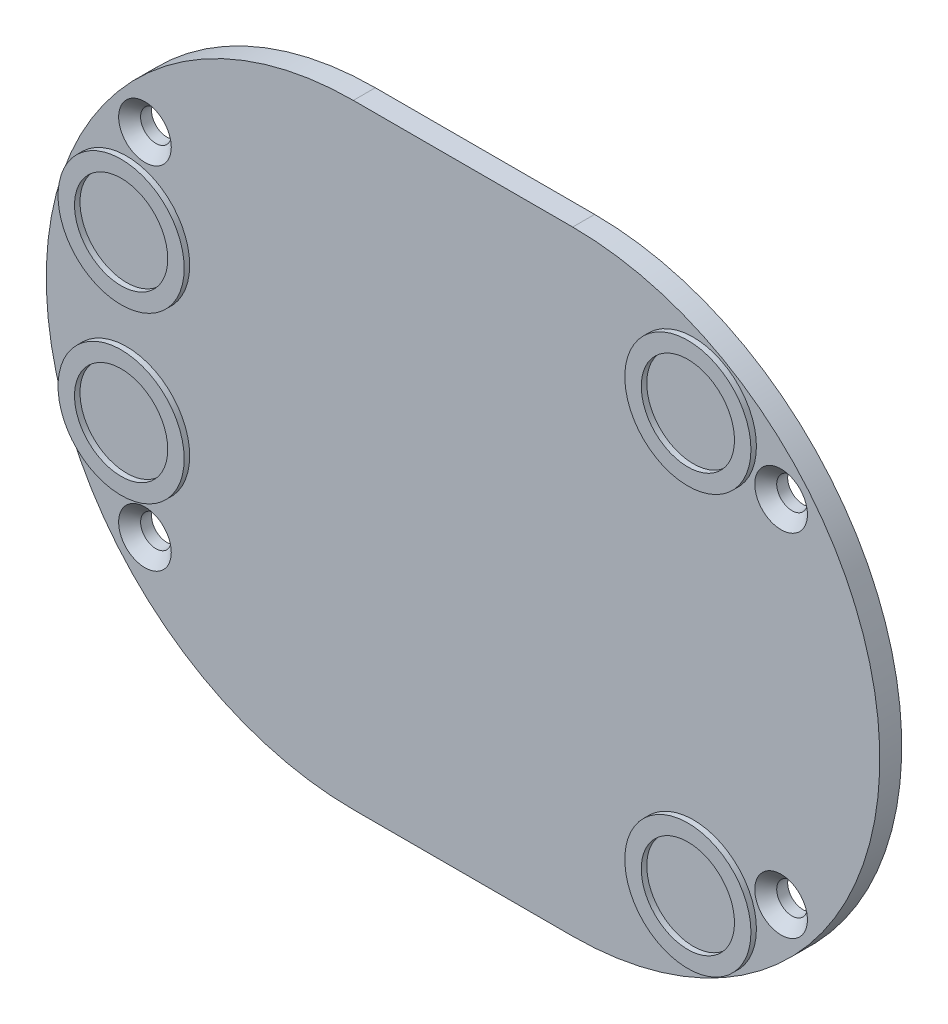
ISO-10303-21;
HEADER;
FILE_DESCRIPTION(('STEP AP214'),'2;1');
FILE_NAME('part.step','',(''),(''),'','','');
FILE_SCHEMA(('AUTOMOTIVE_DESIGN { 1 0 10303 214 1 1 1 1 }'));
ENDSEC;
DATA;
#1=APPLICATION_CONTEXT('core data for automotive mechanical design processes');
#2=APPLICATION_PROTOCOL_DEFINITION('international standard','automotive_design',2000,#1);
#3=PRODUCT_CONTEXT('',#1,'mechanical');
#4=PRODUCT('Part','Part','',(#3));
#5=PRODUCT_RELATED_PRODUCT_CATEGORY('part','',(#4));
#6=PRODUCT_DEFINITION_FORMATION('','',#4);
#7=PRODUCT_DEFINITION_CONTEXT('part definition',#1,'design');
#8=PRODUCT_DEFINITION('design','',#6,#7);
#9=PRODUCT_DEFINITION_SHAPE('','',#8);
#10=(LENGTH_UNIT() NAMED_UNIT(*) SI_UNIT(.MILLI.,.METRE.));
#11=(NAMED_UNIT(*) PLANE_ANGLE_UNIT() SI_UNIT($,.RADIAN.));
#12=(NAMED_UNIT(*) SI_UNIT($,.STERADIAN.) SOLID_ANGLE_UNIT());
#13=UNCERTAINTY_MEASURE_WITH_UNIT(LENGTH_MEASURE(1.E-05),#10,'distance_accuracy_value','');
#14=(GEOMETRIC_REPRESENTATION_CONTEXT(3) GLOBAL_UNCERTAINTY_ASSIGNED_CONTEXT((#13)) GLOBAL_UNIT_ASSIGNED_CONTEXT((#10,
#11,#12)) REPRESENTATION_CONTEXT('',''));
#15=CARTESIAN_POINT('',(0.,0.,0.));
#16=DIRECTION('',(0.,0.,1.));
#17=DIRECTION('',(1.,0.,0.));
#18=AXIS2_PLACEMENT_3D('',#15,#16,#17);
#19=CARTESIAN_POINT('',(-10.,0.,2.));
#20=DIRECTION('',(0.,0.,-1.));
#21=DIRECTION('',(-1.,0.,0.));
#22=AXIS2_PLACEMENT_3D('',#19,#20,#21);
#23=CYLINDRICAL_SURFACE('',#22,28.);
#24=CARTESIAN_POINT('',(-10.,0.,0.));
#25=DIRECTION('',(0.,0.,1.));
#26=DIRECTION('',(1.,0.,0.));
#27=AXIS2_PLACEMENT_3D('',#24,#25,#26);
#28=CIRCLE('',#27,28.);
#29=CARTESIAN_POINT('',(-10.,28.,0.));
#30=VERTEX_POINT('',#29);
#31=CARTESIAN_POINT('',(-10.,-28.,0.));
#32=VERTEX_POINT('',#31);
#33=EDGE_CURVE('E266',#30,#32,#28,.T.);
#34=ORIENTED_EDGE('',*,*,#33,.T.);
#35=DIRECTION('',(0.,0.,-1.));
#36=VECTOR('',#35,1.);
#37=CARTESIAN_POINT('',(-10.,-28.,2.));
#38=LINE('',#37,#36);
#39=CARTESIAN_POINT('',(-10.,-28.,2.));
#40=VERTEX_POINT('',#39);
#41=EDGE_CURVE('E282',#40,#32,#38,.T.);
#42=ORIENTED_EDGE('',*,*,#41,.F.);
#43=CARTESIAN_POINT('',(-10.,0.,2.));
#44=DIRECTION('',(0.,0.,1.));
#45=DIRECTION('',(1.,0.,0.));
#46=AXIS2_PLACEMENT_3D('',#43,#44,#45);
#47=CIRCLE('',#46,28.);
#48=CARTESIAN_POINT('',(-10.,28.,2.));
#49=VERTEX_POINT('',#48);
#50=EDGE_CURVE('E254',#49,#40,#47,.T.);
#51=ORIENTED_EDGE('',*,*,#50,.F.);
#52=DIRECTION('',(0.,0.,-1.));
#53=VECTOR('',#52,1.);
#54=CARTESIAN_POINT('',(-10.,28.,2.));
#55=LINE('',#54,#53);
#56=EDGE_CURVE('E265',#49,#30,#55,.T.);
#57=ORIENTED_EDGE('',*,*,#56,.T.);
#58=EDGE_LOOP('',(#34,#42,#51,#57));
#59=FACE_BOUND('',#58,.T.);
#60=ADVANCED_FACE('F63',(#59),#23,.T.);
#61=CARTESIAN_POINT('',(10.,-28.,2.));
#62=DIRECTION('',(0.,-1.,0.));
#63=DIRECTION('',(1.,0.,0.));
#64=AXIS2_PLACEMENT_3D('',#61,#62,#63);
#65=PLANE('',#64);
#66=DIRECTION('',(-1.,0.,0.));
#67=VECTOR('',#66,1.);
#68=CARTESIAN_POINT('',(10.,-28.,0.));
#69=LINE('',#68,#67);
#70=CARTESIAN_POINT('',(10.,-28.,0.));
#71=VERTEX_POINT('',#70);
#72=EDGE_CURVE('E269',#71,#32,#69,.T.);
#73=ORIENTED_EDGE('',*,*,#72,.F.);
#74=DIRECTION('',(0.,0.,-1.));
#75=VECTOR('',#74,1.);
#76=CARTESIAN_POINT('',(10.,-28.,2.));
#77=LINE('',#76,#75);
#78=CARTESIAN_POINT('',(10.,-28.,2.));
#79=VERTEX_POINT('',#78);
#80=EDGE_CURVE('E280',#79,#71,#77,.T.);
#81=ORIENTED_EDGE('',*,*,#80,.F.);
#82=DIRECTION('',(-1.,0.,0.));
#83=VECTOR('',#82,1.);
#84=CARTESIAN_POINT('',(10.,-28.,2.));
#85=LINE('',#84,#83);
#86=EDGE_CURVE('E256',#79,#40,#85,.T.);
#87=ORIENTED_EDGE('',*,*,#86,.T.);
#88=ORIENTED_EDGE('',*,*,#41,.T.);
#89=EDGE_LOOP('',(#73,#81,#87,#88));
#90=FACE_BOUND('',#89,.T.);
#91=ADVANCED_FACE('F556',(#90),#65,.T.);
#92=CARTESIAN_POINT('',(10.,0.,2.));
#93=DIRECTION('',(0.,0.,-1.));
#94=DIRECTION('',(-1.,0.,0.));
#95=AXIS2_PLACEMENT_3D('',#92,#93,#94);
#96=CYLINDRICAL_SURFACE('',#95,28.);
#97=CARTESIAN_POINT('',(10.,0.,0.));
#98=DIRECTION('',(0.,0.,1.));
#99=DIRECTION('',(1.,0.,0.));
#100=AXIS2_PLACEMENT_3D('',#97,#98,#99);
#101=CIRCLE('',#100,28.);
#102=CARTESIAN_POINT('',(10.,28.,0.));
#103=VERTEX_POINT('',#102);
#104=EDGE_CURVE('E272',#71,#103,#101,.T.);
#105=ORIENTED_EDGE('',*,*,#104,.T.);
#106=DIRECTION('',(0.,0.,-1.));
#107=VECTOR('',#106,1.);
#108=CARTESIAN_POINT('',(10.,28.,2.));
#109=LINE('',#108,#107);
#110=CARTESIAN_POINT('',(10.,28.,2.));
#111=VERTEX_POINT('',#110);
#112=EDGE_CURVE('E278',#111,#103,#109,.T.);
#113=ORIENTED_EDGE('',*,*,#112,.F.);
#114=CARTESIAN_POINT('',(10.,0.,2.));
#115=DIRECTION('',(0.,0.,1.));
#116=DIRECTION('',(1.,0.,0.));
#117=AXIS2_PLACEMENT_3D('',#114,#115,#116);
#118=CIRCLE('',#117,28.);
#119=EDGE_CURVE('E260',#79,#111,#118,.T.);
#120=ORIENTED_EDGE('',*,*,#119,.F.);
#121=ORIENTED_EDGE('',*,*,#80,.T.);
#122=EDGE_LOOP('',(#105,#113,#120,#121));
#123=FACE_BOUND('',#122,.T.);
#124=ADVANCED_FACE('F561',(#123),#96,.T.);
#125=CARTESIAN_POINT('',(-10.,28.,2.));
#126=DIRECTION('',(0.,1.,0.));
#127=DIRECTION('',(-1.,0.,0.));
#128=AXIS2_PLACEMENT_3D('',#125,#126,#127);
#129=PLANE('',#128);
#130=DIRECTION('',(1.,0.,0.));
#131=VECTOR('',#130,1.);
#132=CARTESIAN_POINT('',(-10.,28.,0.));
#133=LINE('',#132,#131);
#134=EDGE_CURVE('E257',#30,#103,#133,.T.);
#135=ORIENTED_EDGE('',*,*,#134,.F.);
#136=ORIENTED_EDGE('',*,*,#56,.F.);
#137=DIRECTION('',(1.,0.,0.));
#138=VECTOR('',#137,1.);
#139=CARTESIAN_POINT('',(-10.,28.,2.));
#140=LINE('',#139,#138);
#141=EDGE_CURVE('E262',#49,#111,#140,.T.);
#142=ORIENTED_EDGE('',*,*,#141,.T.);
#143=ORIENTED_EDGE('',*,*,#112,.T.);
#144=EDGE_LOOP('',(#135,#136,#142,#143));
#145=FACE_BOUND('',#144,.T.);
#146=ADVANCED_FACE('F439',(#145),#129,.T.);
#147=CARTESIAN_POINT('',(-10.,0.,2.));
#148=DIRECTION('',(0.,0.,1.));
#149=DIRECTION('',(1.,0.,0.));
#150=AXIS2_PLACEMENT_3D('',#147,#148,#149);
#151=PLANE('',#150);
#152=CARTESIAN_POINT('',(-30.67323765729,-7.52444315316473,2.));
#153=DIRECTION('',(0.,0.,1.));
#154=DIRECTION('',(1.,0.,0.));
#155=AXIS2_PLACEMENT_3D('',#152,#153,#154);
#156=CIRCLE('',#155,5.75);
#157=CARTESIAN_POINT('',(-24.92323765729,-7.52444315316473,2.));
#158=VERTEX_POINT('',#157);
#159=EDGE_CURVE('E211',#158,#158,#156,.T.);
#160=ORIENTED_EDGE('',*,*,#159,.F.);
#161=EDGE_LOOP('',(#160));
#162=FACE_BOUND('',#161,.T.);
#163=CARTESIAN_POINT('',(21.0000000000001,19.0525588832576,2.));
#164=DIRECTION('',(0.,0.,1.));
#165=DIRECTION('',(1.,0.,0.));
#166=AXIS2_PLACEMENT_3D('',#163,#164,#165);
#167=CIRCLE('',#166,5.75);
#168=CARTESIAN_POINT('',(26.7500000000001,19.0525588832576,2.));
#169=VERTEX_POINT('',#168);
#170=EDGE_CURVE('E193',#169,#169,#167,.T.);
#171=ORIENTED_EDGE('',*,*,#170,.F.);
#172=EDGE_LOOP('',(#171));
#173=FACE_BOUND('',#172,.T.);
#174=CARTESIAN_POINT('',(21.0000000000001,-19.0525588832576,2.));
#175=DIRECTION('',(0.,0.,1.));
#176=DIRECTION('',(1.,0.,0.));
#177=AXIS2_PLACEMENT_3D('',#174,#175,#176);
#178=CIRCLE('',#177,5.75);
#179=CARTESIAN_POINT('',(26.7500000000001,-19.0525588832576,2.));
#180=VERTEX_POINT('',#179);
#181=EDGE_CURVE('E202',#180,#180,#178,.T.);
#182=ORIENTED_EDGE('',*,*,#181,.F.);
#183=EDGE_LOOP('',(#182));
#184=FACE_BOUND('',#183,.T.);
#185=CARTESIAN_POINT('',(-30.67323765729,7.52444315316473,2.));
#186=DIRECTION('',(0.,0.,1.));
#187=DIRECTION('',(1.,0.,0.));
#188=AXIS2_PLACEMENT_3D('',#185,#186,#187);
#189=CIRCLE('',#188,5.75);
#190=CARTESIAN_POINT('',(-24.92323765729,7.52444315316473,2.));
#191=VERTEX_POINT('',#190);
#192=EDGE_CURVE('E220',#191,#191,#189,.T.);
#193=ORIENTED_EDGE('',*,*,#192,.F.);
#194=EDGE_LOOP('',(#193));
#195=FACE_BOUND('',#194,.T.);
#196=CARTESIAN_POINT('',(-29.,16.,2.));
#197=DIRECTION('',(0.,0.,1.));
#198=DIRECTION('',(1.,0.,0.));
#199=AXIS2_PLACEMENT_3D('',#196,#197,#198);
#200=CIRCLE('',#199,2.4);
#201=CARTESIAN_POINT('',(-26.6,16.,2.));
#202=VERTEX_POINT('',#201);
#203=EDGE_CURVE('E224',#202,#202,#200,.T.);
#204=ORIENTED_EDGE('',*,*,#203,.F.);
#205=EDGE_LOOP('',(#204));
#206=FACE_BOUND('',#205,.T.);
#207=CARTESIAN_POINT('',(-29.,-16.,2.));
#208=DIRECTION('',(0.,0.,1.));
#209=DIRECTION('',(1.,0.,0.));
#210=AXIS2_PLACEMENT_3D('',#207,#208,#209);
#211=CIRCLE('',#210,2.4);
#212=CARTESIAN_POINT('',(-26.6,-16.,2.));
#213=VERTEX_POINT('',#212);
#214=EDGE_CURVE('E233',#213,#213,#211,.T.);
#215=ORIENTED_EDGE('',*,*,#214,.F.);
#216=EDGE_LOOP('',(#215));
#217=FACE_BOUND('',#216,.T.);
#218=CARTESIAN_POINT('',(29.,16.,2.));
#219=DIRECTION('',(0.,0.,1.));
#220=DIRECTION('',(1.,0.,0.));
#221=AXIS2_PLACEMENT_3D('',#218,#219,#220);
#222=CIRCLE('',#221,2.4);
#223=CARTESIAN_POINT('',(31.4,16.,2.));
#224=VERTEX_POINT('',#223);
#225=EDGE_CURVE('E240',#224,#224,#222,.T.);
#226=ORIENTED_EDGE('',*,*,#225,.F.);
#227=EDGE_LOOP('',(#226));
#228=FACE_BOUND('',#227,.T.);
#229=CARTESIAN_POINT('',(29.,-16.,2.));
#230=DIRECTION('',(0.,0.,1.));
#231=DIRECTION('',(1.,0.,0.));
#232=AXIS2_PLACEMENT_3D('',#229,#230,#231);
#233=CIRCLE('',#232,2.4);
#234=CARTESIAN_POINT('',(31.4,-16.,2.));
#235=VERTEX_POINT('',#234);
#236=EDGE_CURVE('E247',#235,#235,#233,.T.);
#237=ORIENTED_EDGE('',*,*,#236,.F.);
#238=EDGE_LOOP('',(#237));
#239=FACE_BOUND('',#238,.T.);
#240=ORIENTED_EDGE('',*,*,#50,.T.);
#241=ORIENTED_EDGE('',*,*,#86,.F.);
#242=ORIENTED_EDGE('',*,*,#119,.T.);
#243=ORIENTED_EDGE('',*,*,#141,.F.);
#244=EDGE_LOOP('',(#240,#241,#242,#243));
#245=FACE_BOUND('',#244,.T.);
#246=ADVANCED_FACE('F436',(#162,#173,#184,#195,#206,#217,#228,#239,#245),#151,.T.);
#247=CARTESIAN_POINT('',(-10.,0.,0.));
#248=DIRECTION('',(0.,0.,1.));
#249=DIRECTION('',(1.,0.,0.));
#250=AXIS2_PLACEMENT_3D('',#247,#248,#249);
#251=PLANE('',#250);
#252=CARTESIAN_POINT('',(-10.,0.,0.));
#253=DIRECTION('',(0.,0.,1.));
#254=DIRECTION('',(1.,0.,0.));
#255=AXIS2_PLACEMENT_3D('',#252,#253,#254);
#256=CIRCLE('',#255,20.);
#257=CARTESIAN_POINT('',(-27.2301959989557,-10.1548188480923,0.));
#258=VERTEX_POINT('',#257);
#259=CARTESIAN_POINT('',(-8.24848405351331,-19.9231571767429,0.));
#260=VERTEX_POINT('',#259);
#261=EDGE_CURVE('E513',#258,#260,#256,.T.);
#262=ORIENTED_EDGE('',*,*,#261,.T.);
#263=DIRECTION('',(0.0875757973243352,-0.996157858837146,0.));
#264=VECTOR('',#263,1.);
#265=CARTESIAN_POINT('',(-10.,0.,0.));
#266=LINE('',#265,#264);
#267=CARTESIAN_POINT('',(-8.64257514147281,-15.4404468119758,0.));
#268=VERTEX_POINT('',#267);
#269=EDGE_CURVE('E304',#268,#260,#266,.T.);
#270=ORIENTED_EDGE('',*,*,#269,.F.);
#271=CARTESIAN_POINT('',(-10.,0.,0.));
#272=DIRECTION('',(0.,0.,1.));
#273=DIRECTION('',(1.,0.,0.));
#274=AXIS2_PLACEMENT_3D('',#271,#272,#273);
#275=CIRCLE('',#274,15.5);
#276=CARTESIAN_POINT('',(-22.3291467453701,-9.39372878739485,0.));
#277=VERTEX_POINT('',#276);
#278=EDGE_CURVE('E315',#268,#277,#275,.F.);
#279=ORIENTED_EDGE('',*,*,#278,.T.);
#280=CARTESIAN_POINT('',(-25.6958304936898,-9.25052276259843,0.));
#281=CARTESIAN_POINT('',(-25.5508505082756,-9.25713766604152,7.79949145146986E-10));
#282=CARTESIAN_POINT('',(-25.4058680921355,-9.26369935576357,1.28018170873643E-08));
#283=CARTESIAN_POINT('',(-25.1172462352044,-9.27665239821164,4.59298401372814E-08));
#284=CARTESIAN_POINT('',(-24.9736068400266,-9.28304476739964,6.69505008030306E-08));
#285=CARTESIAN_POINT('',(-24.687671530151,-9.29565888724976,1.05001534315334E-07));
#286=CARTESIAN_POINT('',(-24.5453756612703,-9.3018816762459,1.2206751220053E-07));
#287=CARTESIAN_POINT('',(-24.2621278921691,-9.31415635423719,1.45340200367851E-07));
#288=CARTESIAN_POINT('',(-24.1211760379274,-9.32020930406567,1.51648312001338E-07));
#289=CARTESIAN_POINT('',(-23.8406167629629,-9.33214407347191,1.51101050797173E-07));
#290=CARTESIAN_POINT('',(-23.7010093883397,-9.33802697654072,1.44371106252586E-07));
#291=CARTESIAN_POINT('',(-23.423139508972,-9.34962146407017,1.20403003399722E-07));
#292=CARTESIAN_POINT('',(-23.2848770504007,-9.35533415493065,1.03267061603478E-07));
#293=CARTESIAN_POINT('',(-23.0096974054268,-9.36658809038661,6.53883232290957E-08));
#294=CARTESIAN_POINT('',(-22.8727802652249,-9.37213046436405,4.46823779109791E-08));
#295=CARTESIAN_POINT('',(-22.6002916218868,-9.38304366379444,1.24943706995844E-08));
#296=CARTESIAN_POINT('',(-22.4647201649142,-9.3884156420316,9.23354066113793E-10));
#297=CARTESIAN_POINT('',(-22.3291463819645,-9.39372834490868,0.));
#298=B_SPLINE_CURVE_WITH_KNOTS('',3,(#280,#281,#282,#283,#284,#285,#286,#287,#288,#289,#290,
#291,#292,#293,#294,#295,#296,#297),.UNSPECIFIED.,.F.,.F.,(4,2,2,2,2,2,2,2,4),(0.,
0.435392435698575,0.866737087632124,1.29403265230747,1.71727789220256,2.13647165378525,
2.55161288445858,2.96270064845546,3.36973414170651),.UNSPECIFIED.);
#299=CARTESIAN_POINT('',(-25.6958304801805,-9.25052246685172,0.));
#300=VERTEX_POINT('',#299);
#301=EDGE_CURVE('E12',#277,#300,#298,.F.);
#302=ORIENTED_EDGE('',*,*,#301,.T.);
#303=DIRECTION('',(0.861509799947785,0.507740942404616,0.));
#304=VECTOR('',#303,1.);
#305=CARTESIAN_POINT('',(-10.,0.,0.));
#306=LINE('',#305,#304);
#307=EDGE_CURVE('E306',#258,#300,#306,.T.);
#308=ORIENTED_EDGE('',*,*,#307,.F.);
#309=EDGE_LOOP('',(#262,#270,#279,#302,#308));
#310=FACE_BOUND('',#309,.T.);
#311=CARTESIAN_POINT('',(-29.,16.,0.));
#312=DIRECTION('',(0.,0.,1.));
#313=DIRECTION('',(1.,0.,0.));
#314=AXIS2_PLACEMENT_3D('',#311,#312,#313);
#315=CIRCLE('',#314,1.4);
#316=CARTESIAN_POINT('',(-27.6,16.,0.));
#317=VERTEX_POINT('',#316);
#318=EDGE_CURVE('E232',#317,#317,#315,.T.);
#319=ORIENTED_EDGE('',*,*,#318,.T.);
#320=EDGE_LOOP('',(#319));
#321=FACE_BOUND('',#320,.T.);
#322=CARTESIAN_POINT('',(-29.,-16.,0.));
#323=DIRECTION('',(0.,0.,1.));
#324=DIRECTION('',(1.,0.,0.));
#325=AXIS2_PLACEMENT_3D('',#322,#323,#324);
#326=CIRCLE('',#325,1.4);
#327=CARTESIAN_POINT('',(-27.6,-16.,0.));
#328=VERTEX_POINT('',#327);
#329=EDGE_CURVE('E239',#328,#328,#326,.T.);
#330=ORIENTED_EDGE('',*,*,#329,.T.);
#331=EDGE_LOOP('',(#330));
#332=FACE_BOUND('',#331,.T.);
#333=CARTESIAN_POINT('',(29.,16.,0.));
#334=DIRECTION('',(0.,0.,1.));
#335=DIRECTION('',(1.,0.,0.));
#336=AXIS2_PLACEMENT_3D('',#333,#334,#335);
#337=CIRCLE('',#336,1.4);
#338=CARTESIAN_POINT('',(30.4,16.,0.));
#339=VERTEX_POINT('',#338);
#340=EDGE_CURVE('E246',#339,#339,#337,.T.);
#341=ORIENTED_EDGE('',*,*,#340,.T.);
#342=EDGE_LOOP('',(#341));
#343=FACE_BOUND('',#342,.T.);
#344=CARTESIAN_POINT('',(29.,-16.,0.));
#345=DIRECTION('',(0.,0.,1.));
#346=DIRECTION('',(1.,0.,0.));
#347=AXIS2_PLACEMENT_3D('',#344,#345,#346);
#348=CIRCLE('',#347,1.4);
#349=CARTESIAN_POINT('',(30.4,-16.,0.));
#350=VERTEX_POINT('',#349);
#351=EDGE_CURVE('E253',#350,#350,#348,.T.);
#352=ORIENTED_EDGE('',*,*,#351,.T.);
#353=EDGE_LOOP('',(#352));
#354=FACE_BOUND('',#353,.T.);
#355=ORIENTED_EDGE('',*,*,#33,.F.);
#356=ORIENTED_EDGE('',*,*,#134,.T.);
#357=ORIENTED_EDGE('',*,*,#104,.F.);
#358=ORIENTED_EDGE('',*,*,#72,.T.);
#359=EDGE_LOOP('',(#355,#356,#357,#358));
#360=FACE_BOUND('',#359,.T.);
#361=ADVANCED_FACE('F434',(#310,#321,#332,#343,#354,#360),#251,.F.);
#362=CARTESIAN_POINT('',(29.,-16.,2.));
#363=DIRECTION('',(0.,0.,1.));
#364=DIRECTION('',(1.,0.,0.));
#365=AXIS2_PLACEMENT_3D('',#362,#363,#364);
#366=CYLINDRICAL_SURFACE('',#365,1.4);
#367=CARTESIAN_POINT('',(29.,-16.,0.999999999999999));
#368=DIRECTION('',(0.,0.,1.));
#369=DIRECTION('',(1.,0.,0.));
#370=AXIS2_PLACEMENT_3D('',#367,#368,#369);
#371=CIRCLE('',#370,1.4);
#372=CARTESIAN_POINT('',(30.4,-16.,0.999999999999999));
#373=VERTEX_POINT('',#372);
#374=EDGE_CURVE('E250',#373,#373,#371,.T.);
#375=ORIENTED_EDGE('',*,*,#374,.T.);
#376=EDGE_LOOP('',(#375));
#377=FACE_BOUND('',#376,.T.);
#378=ORIENTED_EDGE('',*,*,#351,.F.);
#379=EDGE_LOOP('',(#378));
#380=FACE_BOUND('',#379,.T.);
#381=ADVANCED_FACE('F430',(#377,#380),#366,.F.);
#382=CARTESIAN_POINT('',(29.,-16.,2.));
#383=DIRECTION('',(0.,0.,1.));
#384=DIRECTION('',(1.,0.,0.));
#385=AXIS2_PLACEMENT_3D('',#382,#383,#384);
#386=CONICAL_SURFACE('',#385,2.4,0.78539816339745);
#387=ORIENTED_EDGE('',*,*,#374,.F.);
#388=EDGE_LOOP('',(#387));
#389=FACE_BOUND('',#388,.T.);
#390=ORIENTED_EDGE('',*,*,#236,.T.);
#391=EDGE_LOOP('',(#390));
#392=FACE_BOUND('',#391,.T.);
#393=ADVANCED_FACE('F426',(#389,#392),#386,.F.);
#394=CARTESIAN_POINT('',(29.,16.,2.));
#395=DIRECTION('',(0.,0.,1.));
#396=DIRECTION('',(1.,0.,0.));
#397=AXIS2_PLACEMENT_3D('',#394,#395,#396);
#398=CYLINDRICAL_SURFACE('',#397,1.4);
#399=CARTESIAN_POINT('',(29.,16.,0.999999999999999));
#400=DIRECTION('',(0.,0.,1.));
#401=DIRECTION('',(1.,0.,0.));
#402=AXIS2_PLACEMENT_3D('',#399,#400,#401);
#403=CIRCLE('',#402,1.4);
#404=CARTESIAN_POINT('',(30.4,16.,0.999999999999999));
#405=VERTEX_POINT('',#404);
#406=EDGE_CURVE('E243',#405,#405,#403,.T.);
#407=ORIENTED_EDGE('',*,*,#406,.T.);
#408=EDGE_LOOP('',(#407));
#409=FACE_BOUND('',#408,.T.);
#410=ORIENTED_EDGE('',*,*,#340,.F.);
#411=EDGE_LOOP('',(#410));
#412=FACE_BOUND('',#411,.T.);
#413=ADVANCED_FACE('F422',(#409,#412),#398,.F.);
#414=CARTESIAN_POINT('',(29.,16.,2.));
#415=DIRECTION('',(0.,0.,1.));
#416=DIRECTION('',(1.,0.,0.));
#417=AXIS2_PLACEMENT_3D('',#414,#415,#416);
#418=CONICAL_SURFACE('',#417,2.4,0.78539816339745);
#419=ORIENTED_EDGE('',*,*,#406,.F.);
#420=EDGE_LOOP('',(#419));
#421=FACE_BOUND('',#420,.T.);
#422=ORIENTED_EDGE('',*,*,#225,.T.);
#423=EDGE_LOOP('',(#422));
#424=FACE_BOUND('',#423,.T.);
#425=ADVANCED_FACE('F418',(#421,#424),#418,.F.);
#426=CARTESIAN_POINT('',(-29.,-16.,2.));
#427=DIRECTION('',(0.,0.,1.));
#428=DIRECTION('',(1.,0.,0.));
#429=AXIS2_PLACEMENT_3D('',#426,#427,#428);
#430=CYLINDRICAL_SURFACE('',#429,1.4);
#431=CARTESIAN_POINT('',(-29.,-16.,0.999999999999999));
#432=DIRECTION('',(0.,0.,1.));
#433=DIRECTION('',(1.,0.,0.));
#434=AXIS2_PLACEMENT_3D('',#431,#432,#433);
#435=CIRCLE('',#434,1.4);
#436=CARTESIAN_POINT('',(-27.6,-16.,0.999999999999999));
#437=VERTEX_POINT('',#436);
#438=EDGE_CURVE('E236',#437,#437,#435,.T.);
#439=ORIENTED_EDGE('',*,*,#438,.T.);
#440=EDGE_LOOP('',(#439));
#441=FACE_BOUND('',#440,.T.);
#442=ORIENTED_EDGE('',*,*,#329,.F.);
#443=EDGE_LOOP('',(#442));
#444=FACE_BOUND('',#443,.T.);
#445=ADVANCED_FACE('F414',(#441,#444),#430,.F.);
#446=CARTESIAN_POINT('',(-29.,-16.,2.));
#447=DIRECTION('',(0.,0.,1.));
#448=DIRECTION('',(1.,0.,0.));
#449=AXIS2_PLACEMENT_3D('',#446,#447,#448);
#450=CONICAL_SURFACE('',#449,2.4,0.785398163397448);
#451=ORIENTED_EDGE('',*,*,#438,.F.);
#452=EDGE_LOOP('',(#451));
#453=FACE_BOUND('',#452,.T.);
#454=ORIENTED_EDGE('',*,*,#214,.T.);
#455=EDGE_LOOP('',(#454));
#456=FACE_BOUND('',#455,.T.);
#457=ADVANCED_FACE('F410',(#453,#456),#450,.F.);
#458=CARTESIAN_POINT('',(-29.,16.,2.));
#459=DIRECTION('',(0.,0.,1.));
#460=DIRECTION('',(1.,0.,0.));
#461=AXIS2_PLACEMENT_3D('',#458,#459,#460);
#462=CYLINDRICAL_SURFACE('',#461,1.4);
#463=CARTESIAN_POINT('',(-29.,16.,0.999999999999999));
#464=DIRECTION('',(0.,0.,1.));
#465=DIRECTION('',(1.,0.,0.));
#466=AXIS2_PLACEMENT_3D('',#463,#464,#465);
#467=CIRCLE('',#466,1.4);
#468=CARTESIAN_POINT('',(-27.6,16.,0.999999999999999));
#469=VERTEX_POINT('',#468);
#470=EDGE_CURVE('E229',#469,#469,#467,.T.);
#471=ORIENTED_EDGE('',*,*,#470,.T.);
#472=EDGE_LOOP('',(#471));
#473=FACE_BOUND('',#472,.T.);
#474=ORIENTED_EDGE('',*,*,#318,.F.);
#475=EDGE_LOOP('',(#474));
#476=FACE_BOUND('',#475,.T.);
#477=ADVANCED_FACE('F406',(#473,#476),#462,.F.);
#478=CARTESIAN_POINT('',(-29.,16.,2.));
#479=DIRECTION('',(0.,0.,1.));
#480=DIRECTION('',(1.,0.,0.));
#481=AXIS2_PLACEMENT_3D('',#478,#479,#480);
#482=CONICAL_SURFACE('',#481,2.4,0.785398163397448);
#483=ORIENTED_EDGE('',*,*,#470,.F.);
#484=EDGE_LOOP('',(#483));
#485=FACE_BOUND('',#484,.T.);
#486=ORIENTED_EDGE('',*,*,#203,.T.);
#487=EDGE_LOOP('',(#486));
#488=FACE_BOUND('',#487,.T.);
#489=ADVANCED_FACE('F399',(#485,#488),#482,.F.);
#490=CARTESIAN_POINT('',(-30.67323765729,7.52444315316473,2.5));
#491=DIRECTION('',(0.,0.,1.));
#492=DIRECTION('',(1.,0.,0.));
#493=AXIS2_PLACEMENT_3D('',#490,#491,#492);
#494=PLANE('',#493);
#495=CARTESIAN_POINT('',(-30.67323765729,7.52444315316473,2.5));
#496=DIRECTION('',(0.,0.,1.));
#497=DIRECTION('',(1.,0.,0.));
#498=AXIS2_PLACEMENT_3D('',#495,#496,#497);
#499=CIRCLE('',#498,5.75);
#500=CARTESIAN_POINT('',(-24.92323765729,7.52444315316473,2.5));
#501=VERTEX_POINT('',#500);
#502=EDGE_CURVE('E221',#501,#501,#499,.T.);
#503=ORIENTED_EDGE('',*,*,#502,.T.);
#504=EDGE_LOOP('',(#503));
#505=FACE_BOUND('',#504,.T.);
#506=CARTESIAN_POINT('',(-30.67323765729,7.52444315316473,2.5));
#507=DIRECTION('',(0.,0.,1.));
#508=DIRECTION('',(1.,0.,0.));
#509=AXIS2_PLACEMENT_3D('',#506,#507,#508);
#510=CIRCLE('',#509,4.25);
#511=CARTESIAN_POINT('',(-26.42323765729,7.52444315316473,2.5));
#512=VERTEX_POINT('',#511);
#513=EDGE_CURVE('E215',#512,#512,#510,.T.);
#514=ORIENTED_EDGE('',*,*,#513,.F.);
#515=EDGE_LOOP('',(#514));
#516=FACE_BOUND('',#515,.T.);
#517=ADVANCED_FACE('F396',(#505,#516),#494,.T.);
#518=CARTESIAN_POINT('',(-30.67323765729,7.52444315316473,2.5));
#519=DIRECTION('',(0.,0.,-1.));
#520=DIRECTION('',(-1.,0.,0.));
#521=AXIS2_PLACEMENT_3D('',#518,#519,#520);
#522=CYLINDRICAL_SURFACE('',#521,5.75);
#523=ORIENTED_EDGE('',*,*,#502,.F.);
#524=EDGE_LOOP('',(#523));
#525=FACE_BOUND('',#524,.T.);
#526=ORIENTED_EDGE('',*,*,#192,.T.);
#527=EDGE_LOOP('',(#526));
#528=FACE_BOUND('',#527,.T.);
#529=ADVANCED_FACE('F394',(#525,#528),#522,.T.);
#530=CARTESIAN_POINT('',(-30.67323765729,7.52444315316473,2.5));
#531=DIRECTION('',(0.,0.,-1.));
#532=DIRECTION('',(-1.,0.,0.));
#533=AXIS2_PLACEMENT_3D('',#530,#531,#532);
#534=CYLINDRICAL_SURFACE('',#533,4.25);
#535=ORIENTED_EDGE('',*,*,#513,.T.);
#536=EDGE_LOOP('',(#535));
#537=FACE_BOUND('',#536,.T.);
#538=CARTESIAN_POINT('',(-30.67323765729,7.52444315316473,2.));
#539=DIRECTION('',(0.,0.,1.));
#540=DIRECTION('',(1.,0.,0.));
#541=AXIS2_PLACEMENT_3D('',#538,#539,#540);
#542=CIRCLE('',#541,4.25);
#543=CARTESIAN_POINT('',(-26.42323765729,7.52444315316473,2.));
#544=VERTEX_POINT('',#543);
#545=EDGE_CURVE('E284',#544,#544,#542,.F.);
#546=ORIENTED_EDGE('',*,*,#545,.T.);
#547=EDGE_LOOP('',(#546));
#548=FACE_BOUND('',#547,.T.);
#549=ADVANCED_FACE('F391',(#537,#548),#534,.F.);
#550=ORIENTED_EDGE('',*,*,#545,.F.);
#551=EDGE_LOOP('',(#550));
#552=FACE_BOUND('',#551,.T.);
#553=ADVANCED_FACE('F386',(#552),#151,.T.);
#554=CARTESIAN_POINT('',(-30.67323765729,-7.52444315316473,2.5));
#555=DIRECTION('',(0.,0.,1.));
#556=DIRECTION('',(1.,0.,0.));
#557=AXIS2_PLACEMENT_3D('',#554,#555,#556);
#558=PLANE('',#557);
#559=CARTESIAN_POINT('',(-30.67323765729,-7.52444315316473,2.5));
#560=DIRECTION('',(0.,0.,1.));
#561=DIRECTION('',(1.,0.,0.));
#562=AXIS2_PLACEMENT_3D('',#559,#560,#561);
#563=CIRCLE('',#562,5.75);
#564=CARTESIAN_POINT('',(-24.92323765729,-7.52444315316473,2.5));
#565=VERTEX_POINT('',#564);
#566=EDGE_CURVE('E212',#565,#565,#563,.T.);
#567=ORIENTED_EDGE('',*,*,#566,.T.);
#568=EDGE_LOOP('',(#567));
#569=FACE_BOUND('',#568,.T.);
#570=CARTESIAN_POINT('',(-30.67323765729,-7.52444315316473,2.5));
#571=DIRECTION('',(0.,0.,1.));
#572=DIRECTION('',(1.,0.,0.));
#573=AXIS2_PLACEMENT_3D('',#570,#571,#572);
#574=CIRCLE('',#573,4.25);
#575=CARTESIAN_POINT('',(-26.42323765729,-7.52444315316473,2.5));
#576=VERTEX_POINT('',#575);
#577=EDGE_CURVE('E206',#576,#576,#574,.T.);
#578=ORIENTED_EDGE('',*,*,#577,.F.);
#579=EDGE_LOOP('',(#578));
#580=FACE_BOUND('',#579,.T.);
#581=ADVANCED_FACE('F383',(#569,#580),#558,.T.);
#582=CARTESIAN_POINT('',(-30.67323765729,-7.52444315316473,2.5));
#583=DIRECTION('',(0.,0.,-1.));
#584=DIRECTION('',(-1.,0.,0.));
#585=AXIS2_PLACEMENT_3D('',#582,#583,#584);
#586=CYLINDRICAL_SURFACE('',#585,5.75);
#587=ORIENTED_EDGE('',*,*,#566,.F.);
#588=EDGE_LOOP('',(#587));
#589=FACE_BOUND('',#588,.T.);
#590=ORIENTED_EDGE('',*,*,#159,.T.);
#591=EDGE_LOOP('',(#590));
#592=FACE_BOUND('',#591,.T.);
#593=ADVANCED_FACE('F381',(#589,#592),#586,.T.);
#594=CARTESIAN_POINT('',(-30.67323765729,-7.52444315316473,2.5));
#595=DIRECTION('',(0.,0.,-1.));
#596=DIRECTION('',(-1.,0.,0.));
#597=AXIS2_PLACEMENT_3D('',#594,#595,#596);
#598=CYLINDRICAL_SURFACE('',#597,4.25);
#599=ORIENTED_EDGE('',*,*,#577,.T.);
#600=EDGE_LOOP('',(#599));
#601=FACE_BOUND('',#600,.T.);
#602=CARTESIAN_POINT('',(-30.67323765729,-7.52444315316473,2.));
#603=DIRECTION('',(0.,0.,1.));
#604=DIRECTION('',(1.,0.,0.));
#605=AXIS2_PLACEMENT_3D('',#602,#603,#604);
#606=CIRCLE('',#605,4.25);
#607=CARTESIAN_POINT('',(-26.42323765729,-7.52444315316473,2.));
#608=VERTEX_POINT('',#607);
#609=EDGE_CURVE('E295',#608,#608,#606,.F.);
#610=ORIENTED_EDGE('',*,*,#609,.T.);
#611=EDGE_LOOP('',(#610));
#612=FACE_BOUND('',#611,.T.);
#613=ADVANCED_FACE('F378',(#601,#612),#598,.F.);
#614=ORIENTED_EDGE('',*,*,#609,.F.);
#615=EDGE_LOOP('',(#614));
#616=FACE_BOUND('',#615,.T.);
#617=ADVANCED_FACE('F373',(#616),#151,.T.);
#618=CARTESIAN_POINT('',(21.0000000000001,-19.0525588832576,2.5));
#619=DIRECTION('',(0.,0.,1.));
#620=DIRECTION('',(1.,0.,0.));
#621=AXIS2_PLACEMENT_3D('',#618,#619,#620);
#622=PLANE('',#621);
#623=CARTESIAN_POINT('',(21.0000000000001,-19.0525588832576,2.5));
#624=DIRECTION('',(0.,0.,1.));
#625=DIRECTION('',(1.,0.,0.));
#626=AXIS2_PLACEMENT_3D('',#623,#624,#625);
#627=CIRCLE('',#626,5.75);
#628=CARTESIAN_POINT('',(26.7500000000001,-19.0525588832576,2.5));
#629=VERTEX_POINT('',#628);
#630=EDGE_CURVE('E203',#629,#629,#627,.T.);
#631=ORIENTED_EDGE('',*,*,#630,.T.);
#632=EDGE_LOOP('',(#631));
#633=FACE_BOUND('',#632,.T.);
#634=CARTESIAN_POINT('',(21.0000000000001,-19.0525588832576,2.5));
#635=DIRECTION('',(0.,0.,1.));
#636=DIRECTION('',(1.,0.,0.));
#637=AXIS2_PLACEMENT_3D('',#634,#635,#636);
#638=CIRCLE('',#637,4.25);
#639=CARTESIAN_POINT('',(25.2500000000001,-19.0525588832576,2.5));
#640=VERTEX_POINT('',#639);
#641=EDGE_CURVE('E197',#640,#640,#638,.T.);
#642=ORIENTED_EDGE('',*,*,#641,.F.);
#643=EDGE_LOOP('',(#642));
#644=FACE_BOUND('',#643,.T.);
#645=ADVANCED_FACE('F370',(#633,#644),#622,.T.);
#646=CARTESIAN_POINT('',(21.0000000000001,-19.0525588832576,2.5));
#647=DIRECTION('',(0.,0.,-1.));
#648=DIRECTION('',(-1.,0.,0.));
#649=AXIS2_PLACEMENT_3D('',#646,#647,#648);
#650=CYLINDRICAL_SURFACE('',#649,5.75);
#651=ORIENTED_EDGE('',*,*,#630,.F.);
#652=EDGE_LOOP('',(#651));
#653=FACE_BOUND('',#652,.T.);
#654=ORIENTED_EDGE('',*,*,#181,.T.);
#655=EDGE_LOOP('',(#654));
#656=FACE_BOUND('',#655,.T.);
#657=ADVANCED_FACE('F368',(#653,#656),#650,.T.);
#658=CARTESIAN_POINT('',(21.0000000000001,-19.0525588832576,2.5));
#659=DIRECTION('',(0.,0.,-1.));
#660=DIRECTION('',(-1.,0.,0.));
#661=AXIS2_PLACEMENT_3D('',#658,#659,#660);
#662=CYLINDRICAL_SURFACE('',#661,4.25);
#663=ORIENTED_EDGE('',*,*,#641,.T.);
#664=EDGE_LOOP('',(#663));
#665=FACE_BOUND('',#664,.T.);
#666=CARTESIAN_POINT('',(21.0000000000001,-19.0525588832576,2.));
#667=DIRECTION('',(0.,0.,1.));
#668=DIRECTION('',(1.,0.,0.));
#669=AXIS2_PLACEMENT_3D('',#666,#667,#668);
#670=CIRCLE('',#669,4.25);
#671=CARTESIAN_POINT('',(25.2500000000001,-19.0525588832576,2.));
#672=VERTEX_POINT('',#671);
#673=EDGE_CURVE('E298',#672,#672,#670,.F.);
#674=ORIENTED_EDGE('',*,*,#673,.T.);
#675=EDGE_LOOP('',(#674));
#676=FACE_BOUND('',#675,.T.);
#677=ADVANCED_FACE('F365',(#665,#676),#662,.F.);
#678=ORIENTED_EDGE('',*,*,#673,.F.);
#679=EDGE_LOOP('',(#678));
#680=FACE_BOUND('',#679,.T.);
#681=ADVANCED_FACE('F360',(#680),#151,.T.);
#682=CARTESIAN_POINT('',(21.0000000000001,19.0525588832576,2.5));
#683=DIRECTION('',(0.,0.,1.));
#684=DIRECTION('',(1.,0.,0.));
#685=AXIS2_PLACEMENT_3D('',#682,#683,#684);
#686=PLANE('',#685);
#687=CARTESIAN_POINT('',(21.0000000000001,19.0525588832576,2.5));
#688=DIRECTION('',(0.,0.,1.));
#689=DIRECTION('',(1.,0.,0.));
#690=AXIS2_PLACEMENT_3D('',#687,#688,#689);
#691=CIRCLE('',#690,5.75);
#692=CARTESIAN_POINT('',(26.7500000000001,19.0525588832576,2.5));
#693=VERTEX_POINT('',#692);
#694=EDGE_CURVE('E194',#693,#693,#691,.T.);
#695=ORIENTED_EDGE('',*,*,#694,.T.);
#696=EDGE_LOOP('',(#695));
#697=FACE_BOUND('',#696,.T.);
#698=CARTESIAN_POINT('',(21.0000000000001,19.0525588832576,2.5));
#699=DIRECTION('',(0.,0.,1.));
#700=DIRECTION('',(1.,0.,0.));
#701=AXIS2_PLACEMENT_3D('',#698,#699,#700);
#702=CIRCLE('',#701,4.25);
#703=CARTESIAN_POINT('',(25.2500000000001,19.0525588832576,2.5));
#704=VERTEX_POINT('',#703);
#705=EDGE_CURVE('E189',#704,#704,#702,.T.);
#706=ORIENTED_EDGE('',*,*,#705,.F.);
#707=EDGE_LOOP('',(#706));
#708=FACE_BOUND('',#707,.T.);
#709=ADVANCED_FACE('F357',(#697,#708),#686,.T.);
#710=CARTESIAN_POINT('',(21.0000000000001,19.0525588832576,2.5));
#711=DIRECTION('',(0.,0.,-1.));
#712=DIRECTION('',(-1.,0.,0.));
#713=AXIS2_PLACEMENT_3D('',#710,#711,#712);
#714=CYLINDRICAL_SURFACE('',#713,5.75);
#715=ORIENTED_EDGE('',*,*,#694,.F.);
#716=EDGE_LOOP('',(#715));
#717=FACE_BOUND('',#716,.T.);
#718=ORIENTED_EDGE('',*,*,#170,.T.);
#719=EDGE_LOOP('',(#718));
#720=FACE_BOUND('',#719,.T.);
#721=ADVANCED_FACE('F355',(#717,#720),#714,.T.);
#722=CARTESIAN_POINT('',(21.0000000000001,19.0525588832576,2.5));
#723=DIRECTION('',(0.,0.,-1.));
#724=DIRECTION('',(-1.,0.,0.));
#725=AXIS2_PLACEMENT_3D('',#722,#723,#724);
#726=CYLINDRICAL_SURFACE('',#725,4.25);
#727=ORIENTED_EDGE('',*,*,#705,.T.);
#728=EDGE_LOOP('',(#727));
#729=FACE_BOUND('',#728,.T.);
#730=CARTESIAN_POINT('',(21.0000000000001,19.0525588832576,2.));
#731=DIRECTION('',(0.,0.,1.));
#732=DIRECTION('',(1.,0.,0.));
#733=AXIS2_PLACEMENT_3D('',#730,#731,#732);
#734=CIRCLE('',#733,4.25);
#735=CARTESIAN_POINT('',(25.2500000000001,19.0525588832576,2.));
#736=VERTEX_POINT('',#735);
#737=EDGE_CURVE('E301',#736,#736,#734,.F.);
#738=ORIENTED_EDGE('',*,*,#737,.T.);
#739=EDGE_LOOP('',(#738));
#740=FACE_BOUND('',#739,.T.);
#741=ADVANCED_FACE('F352',(#729,#740),#726,.F.);
#742=ORIENTED_EDGE('',*,*,#737,.F.);
#743=EDGE_LOOP('',(#742));
#744=FACE_BOUND('',#743,.T.);
#745=ADVANCED_FACE('F351',(#744),#151,.T.);
#746=CARTESIAN_POINT('',(-10.,0.,-19.5));
#747=DIRECTION('',(0.,0.,1.));
#748=DIRECTION('',(1.,0.,0.));
#749=AXIS2_PLACEMENT_3D('',#746,#747,#748);
#750=CYLINDRICAL_SURFACE('',#749,19.);
#751=DIRECTION('',(0.,0.,1.));
#752=VECTOR('',#751,1.);
#753=CARTESIAN_POINT('',(-8.33605985083764,-18.9269993179058,-19.5));
#754=LINE('',#753,#752);
#755=CARTESIAN_POINT('',(-8.33605985083764,-18.9269993179058,-19.5));
#756=VERTEX_POINT('',#755);
#757=CARTESIAN_POINT('',(-8.33605985083764,-18.9269993179058,-1.));
#758=VERTEX_POINT('',#757);
#759=EDGE_CURVE('E171',#756,#758,#754,.T.);
#760=ORIENTED_EDGE('',*,*,#759,.T.);
#761=CARTESIAN_POINT('',(-10.,0.,-1.));
#762=DIRECTION('',(0.,0.,1.));
#763=DIRECTION('',(1.,0.,0.));
#764=AXIS2_PLACEMENT_3D('',#761,#762,#763);
#765=CIRCLE('',#764,19.);
#766=CARTESIAN_POINT('',(-26.3686861990079,-9.64707790568776,-1.));
#767=VERTEX_POINT('',#766);
#768=EDGE_CURVE('E512',#758,#767,#765,.F.);
#769=ORIENTED_EDGE('',*,*,#768,.T.);
#770=DIRECTION('',(0.,0.,1.));
#771=VECTOR('',#770,1.);
#772=CARTESIAN_POINT('',(-26.3686861990079,-9.64707790568776,-19.5));
#773=LINE('',#772,#771);
#774=CARTESIAN_POINT('',(-26.3686861990079,-9.64707790568776,-19.5));
#775=VERTEX_POINT('',#774);
#776=EDGE_CURVE('E182',#775,#767,#773,.T.);
#777=ORIENTED_EDGE('',*,*,#776,.F.);
#778=CARTESIAN_POINT('',(-10.,0.,-19.5));
#779=DIRECTION('',(0.,0.,1.));
#780=DIRECTION('',(1.,0.,0.));
#781=AXIS2_PLACEMENT_3D('',#778,#779,#780);
#782=CIRCLE('',#781,19.);
#783=EDGE_CURVE('E163',#775,#756,#782,.T.);
#784=ORIENTED_EDGE('',*,*,#783,.T.);
#785=EDGE_LOOP('',(#760,#769,#777,#784));
#786=FACE_BOUND('',#785,.T.);
#787=ADVANCED_FACE('F180',(#786),#750,.T.);
#788=CARTESIAN_POINT('',(-26.3686861990079,-9.64707790568776,-19.5));
#789=DIRECTION('',(0.507740942404616,-0.861509799947785,0.));
#790=DIRECTION('',(0.861509799947785,0.507740942404616,0.));
#791=AXIS2_PLACEMENT_3D('',#788,#789,#790);
#792=PLANE('',#791);
#793=ORIENTED_EDGE('',*,*,#307,.T.);
#794=CARTESIAN_POINT('',(-27.2451413424616,-10.1636270622261,-1.7885859483094));
#795=CARTESIAN_POINT('',(-26.276333880525,-9.59264897960637,-0.669619410582203));
#796=CARTESIAN_POINT('',(-25.3071384726746,-9.02144225649534,0.448907982054968));
#797=CARTESIAN_POINT('',(-24.3372848264277,-8.44984759283649,1.56663543840564));
#798=B_SPLINE_CURVE_WITH_KNOTS('',3,(#794,#795,#796,#797),.UNSPECIFIED.,.F.,.F.,(4,4),
(0.105846585471447,0.110605804514012),.UNSPECIFIED.);
#799=CARTESIAN_POINT('',(-25.937931299034,-9.39320743448546,-0.279366446605325));
#800=VERTEX_POINT('',#799);
#801=EDGE_CURVE('E327',#300,#800,#798,.F.);
#802=ORIENTED_EDGE('',*,*,#801,.T.);
#803=DIRECTION('',(0.,0.,-1.));
#804=VECTOR('',#803,1.);
#805=CARTESIAN_POINT('',(-25.937931299034,-9.39320743448546,-19.5));
#806=LINE('',#805,#804);
#807=CARTESIAN_POINT('',(-25.937931299034,-9.39320743448546,-19.5));
#808=VERTEX_POINT('',#807);
#809=EDGE_CURVE('E489',#800,#808,#806,.T.);
#810=ORIENTED_EDGE('',*,*,#809,.T.);
#811=DIRECTION('',(0.861509799947785,0.507740942404616,0.));
#812=VECTOR('',#811,1.);
#813=CARTESIAN_POINT('',(-26.3686861990079,-9.64707790568776,-19.5));
#814=LINE('',#813,#812);
#815=EDGE_CURVE('E178',#775,#808,#814,.T.);
#816=ORIENTED_EDGE('',*,*,#815,.F.);
#817=ORIENTED_EDGE('',*,*,#776,.T.);
#818=DIRECTION('',(0.609179421601747,0.359027063460353,-0.707106781186545));
#819=VECTOR('',#818,1.);
#820=CARTESIAN_POINT('',(-9.99999999999998,0.,-19.9999999999999));
#821=LINE('',#820,#819);
#822=EDGE_CURVE('E504',#767,#258,#821,.F.);
#823=ORIENTED_EDGE('',*,*,#822,.T.);
#824=EDGE_LOOP('',(#793,#802,#810,#816,#817,#823));
#825=FACE_BOUND('',#824,.T.);
#826=ADVANCED_FACE('F333',(#825),#792,.F.);
#827=CARTESIAN_POINT('',(-10.,0.,-19.5));
#828=DIRECTION('',(0.,0.,1.));
#829=DIRECTION('',(1.,0.,0.));
#830=AXIS2_PLACEMENT_3D('',#827,#828,#829);
#831=CYLINDRICAL_SURFACE('',#830,16.5);
#832=CARTESIAN_POINT('',(-10.,0.,-19.5));
#833=DIRECTION('',(0.,0.,1.));
#834=DIRECTION('',(1.,0.,0.));
#835=AXIS2_PLACEMENT_3D('',#832,#833,#834);
#836=CIRCLE('',#835,16.5);
#837=CARTESIAN_POINT('',(-23.0087360799774,-10.1500140690294,-19.5));
#838=VERTEX_POINT('',#837);
#839=CARTESIAN_POINT('',(-8.55499934414847,-16.4366046708129,-19.5));
#840=VERTEX_POINT('',#839);
#841=EDGE_CURVE('E165',#838,#840,#836,.T.);
#842=ORIENTED_EDGE('',*,*,#841,.F.);
#843=DIRECTION('',(0.,0.,1.));
#844=VECTOR('',#843,1.);
#845=CARTESIAN_POINT('',(-23.0087360799774,-10.1500140690294,-19.5));
#846=LINE('',#845,#844);
#847=CARTESIAN_POINT('',(-23.0087360799774,-10.1500140690294,-1.00000000000001));
#848=VERTEX_POINT('',#847);
#849=EDGE_CURVE('E496',#838,#848,#846,.T.);
#850=ORIENTED_EDGE('',*,*,#849,.T.);
#851=CARTESIAN_POINT('',(-10.,0.,-1.00000000000001));
#852=DIRECTION('',(0.,0.,1.));
#853=DIRECTION('',(1.,0.,0.));
#854=AXIS2_PLACEMENT_3D('',#851,#852,#853);
#855=CIRCLE('',#854,16.5);
#856=CARTESIAN_POINT('',(-8.55499934414847,-16.4366046708129,-1.00000000000001));
#857=VERTEX_POINT('',#856);
#858=EDGE_CURVE('E510',#848,#857,#855,.T.);
#859=ORIENTED_EDGE('',*,*,#858,.T.);
#860=DIRECTION('',(0.,0.,1.));
#861=VECTOR('',#860,1.);
#862=CARTESIAN_POINT('',(-8.55499934414847,-16.4366046708129,-19.5));
#863=LINE('',#862,#861);
#864=EDGE_CURVE('E177',#840,#857,#863,.T.);
#865=ORIENTED_EDGE('',*,*,#864,.F.);
#866=EDGE_LOOP('',(#842,#850,#859,#865));
#867=FACE_BOUND('',#866,.T.);
#868=ADVANCED_FACE('F343',(#867),#831,.F.);
#869=CARTESIAN_POINT('',(-8.55499934414847,-16.4366046708129,-19.5));
#870=DIRECTION('',(-0.996157858837146,-0.0875757973243352,0.));
#871=DIRECTION('',(0.0875757973243352,-0.996157858837146,0.));
#872=AXIS2_PLACEMENT_3D('',#869,#870,#871);
#873=PLANE('',#872);
#874=ORIENTED_EDGE('',*,*,#864,.T.);
#875=DIRECTION('',(-0.0619254401558558,0.704389977116014,0.707106781186551));
#876=VECTOR('',#875,1.);
#877=CARTESIAN_POINT('',(-10.,0.,15.5000000000001));
#878=LINE('',#877,#876);
#879=EDGE_CURVE('E499',#857,#268,#878,.T.);
#880=ORIENTED_EDGE('',*,*,#879,.T.);
#881=ORIENTED_EDGE('',*,*,#269,.T.);
#882=DIRECTION('',(0.0619254401558563,-0.70438997711602,0.707106781186545));
#883=VECTOR('',#882,1.);
#884=CARTESIAN_POINT('',(-10.,0.,-19.9999999999999));
#885=LINE('',#884,#883);
#886=EDGE_CURVE('E174',#260,#758,#885,.F.);
#887=ORIENTED_EDGE('',*,*,#886,.T.);
#888=ORIENTED_EDGE('',*,*,#759,.F.);
#889=DIRECTION('',(0.0875757973243351,-0.996157858837146,0.));
#890=VECTOR('',#889,1.);
#891=CARTESIAN_POINT('',(-8.55499934414847,-16.4366046708129,-19.5));
#892=LINE('',#891,#890);
#893=EDGE_CURVE('E158',#840,#756,#892,.T.);
#894=ORIENTED_EDGE('',*,*,#893,.F.);
#895=EDGE_LOOP('',(#874,#880,#881,#887,#888,#894));
#896=FACE_BOUND('',#895,.T.);
#897=ADVANCED_FACE('F172',(#896),#873,.F.);
#898=CARTESIAN_POINT('',(-10.,0.,-19.5));
#899=DIRECTION('',(0.,0.,1.));
#900=DIRECTION('',(1.,0.,0.));
#901=AXIS2_PLACEMENT_3D('',#898,#899,#900);
#902=PLANE('',#901);
#903=ORIENTED_EDGE('',*,*,#815,.T.);
#904=DIRECTION('',(-0.968206485062098,0.250152358141389,0.));
#905=VECTOR('',#904,1.);
#906=CARTESIAN_POINT('',(-23.0087360799774,-10.1500140690294,-19.5));
#907=LINE('',#906,#905);
#908=EDGE_CURVE('E495',#808,#838,#907,.F.);
#909=ORIENTED_EDGE('',*,*,#908,.T.);
#910=ORIENTED_EDGE('',*,*,#841,.T.);
#911=ORIENTED_EDGE('',*,*,#893,.T.);
#912=ORIENTED_EDGE('',*,*,#783,.F.);
#913=EDGE_LOOP('',(#903,#909,#910,#911,#912));
#914=FACE_BOUND('',#913,.T.);
#915=ADVANCED_FACE('F161',(#914),#902,.F.);
#916=CARTESIAN_POINT('',(-10.,0.,0.));
#917=DIRECTION('',(0.,0.,1.));
#918=DIRECTION('',(1.,0.,0.));
#919=AXIS2_PLACEMENT_3D('',#916,#917,#918);
#920=CONICAL_SURFACE('',#919,20.,0.785398163397452);
#921=ORIENTED_EDGE('',*,*,#822,.F.);
#922=ORIENTED_EDGE('',*,*,#768,.F.);
#923=ORIENTED_EDGE('',*,*,#886,.F.);
#924=ORIENTED_EDGE('',*,*,#261,.F.);
#925=EDGE_LOOP('',(#921,#922,#923,#924));
#926=FACE_BOUND('',#925,.T.);
#927=ADVANCED_FACE('F537',(#926),#920,.T.);
#928=CARTESIAN_POINT('',(-10.,0.,-1.00000000000001));
#929=DIRECTION('',(0.,0.,-1.));
#930=DIRECTION('',(-1.,0.,0.));
#931=AXIS2_PLACEMENT_3D('',#928,#929,#930);
#932=CONICAL_SURFACE('',#931,16.5,0.785398163397444);
#933=CARTESIAN_POINT('',(-23.0087360799774,-10.1500140690294,-1.00000000000001));
#934=CARTESIAN_POINT('',(-23.2586922354036,-10.0854337107314,-1.15736099771855));
#935=CARTESIAN_POINT('',(-23.5070153906544,-10.0212752653734,-1.31746176983994));
#936=CARTESIAN_POINT('',(-24.0005971761826,-9.89375014600013,-1.64247030251384));
#937=CARTESIAN_POINT('',(-24.2458566670285,-9.83038324964256,-1.80737666775177));
#938=CARTESIAN_POINT('',(-24.7336438344814,-9.70435526688056,-2.14140669053006));
#939=CARTESIAN_POINT('',(-24.9761716469361,-9.6416941453776,-2.31053013699664));
#940=CARTESIAN_POINT('',(-25.4588172966841,-9.51699455980998,-2.65256073368764));
#941=CARTESIAN_POINT('',(-25.6989344213587,-9.45495627986226,-2.82546895732016));
#942=CARTESIAN_POINT('',(-25.937931299034,-9.39320743448546,-3.00000000000004));
#943=B_SPLINE_CURVE_WITH_KNOTS('',3,(#933,#934,#935,#936,#937,#938,#939,#940,#941,#942),
.UNSPECIFIED.,.F.,.F.,(4,2,2,2,4),(0.,0.906990966589245,1.81372115993206,2.72040606026316,
3.62735152732915),.UNSPECIFIED.);
#944=CARTESIAN_POINT('',(-23.4125536109099,-10.0456810479434,-1.25745511951449));
#945=VERTEX_POINT('',#944);
#946=EDGE_CURVE('E497',#848,#945,#943,.T.);
#947=ORIENTED_EDGE('',*,*,#946,.T.);
#948=CARTESIAN_POINT('',(-22.1978255800186,-9.31456952256677,0.152421876032514));
#949=CARTESIAN_POINT('',(-23.1608107017801,-9.89516226967068,-0.965305580318157));
#950=CARTESIAN_POINT('',(-24.1245692758057,-10.4736958979428,-2.08383297295532));
#951=CARTESIAN_POINT('',(-25.0887244473524,-11.0510227621091,-3.20279951068252));
#952=B_SPLINE_CURVE_WITH_KNOTS('',3,(#948,#949,#950,#951),.UNSPECIFIED.,.F.,.F.,(4,4),
(0.105846585471447,0.110605804514012),.UNSPECIFIED.);
#953=EDGE_CURVE('E90',#945,#277,#952,.F.);
#954=ORIENTED_EDGE('',*,*,#953,.T.);
#955=ORIENTED_EDGE('',*,*,#278,.F.);
#956=ORIENTED_EDGE('',*,*,#879,.F.);
#957=ORIENTED_EDGE('',*,*,#858,.F.);
#958=EDGE_LOOP('',(#947,#954,#955,#956,#957));
#959=FACE_BOUND('',#958,.T.);
#960=ADVANCED_FACE('F518',(#959),#932,.F.);
#961=CARTESIAN_POINT('',(-23.0087360799774,-10.1500140690294,-19.5));
#962=DIRECTION('',(-0.250152358141389,-0.968206485062098,0.));
#963=DIRECTION('',(0.,0.,1.));
#964=AXIS2_PLACEMENT_3D('',#961,#962,#963);
#965=PLANE('',#964);
#966=ORIENTED_EDGE('',*,*,#908,.F.);
#967=ORIENTED_EDGE('',*,*,#809,.F.);
#968=CARTESIAN_POINT('',(-23.4125529501629,-10.0456812186585,-1.25745356575835));
#969=CARTESIAN_POINT('',(-23.5169093462434,-10.0187189965097,-1.21681624686775));
#970=CARTESIAN_POINT('',(-23.6212746179378,-9.99175448417464,-1.1762032404822));
#971=CARTESIAN_POINT('',(-23.8302505687884,-9.93776205699811,-1.09493695252081));
#972=CARTESIAN_POINT('',(-23.9348612864239,-9.91073413222054,-1.0542837764957));
#973=CARTESIAN_POINT('',(-24.1443281001672,-9.8566148842967,-0.972937149822626));
#974=CARTESIAN_POINT('',(-24.2491842345312,-9.82952355126463,-0.93224380426185));
#975=CARTESIAN_POINT('',(-24.4591418522557,-9.77527749268533,-0.8508168398081));
#976=CARTESIAN_POINT('',(-24.5642433736525,-9.74812275730534,-0.810083325541749));
#977=CARTESIAN_POINT('',(-24.7746917348952,-9.69374990125207,-0.72857602468811));
#978=CARTESIAN_POINT('',(-24.880038612559,-9.66653177080105,-0.68780234226774));
#979=CARTESIAN_POINT('',(-25.0909776549892,-9.61203213322695,-0.606214706172973));
#980=CARTESIAN_POINT('',(-25.1965698573567,-9.58475061638324,-0.565400856207452));
#981=CARTESIAN_POINT('',(-25.4079995169026,-9.530124215917,-0.483732885805369));
#982=CARTESIAN_POINT('',(-25.5138370114671,-9.50277932263277,-0.442878868620644));
#983=CARTESIAN_POINT('',(-25.7257572228428,-9.44802618057039,-0.361130565300392));
#984=CARTESIAN_POINT('',(-25.8318399768279,-9.42061792219157,-0.320236381962944));
#985=CARTESIAN_POINT('',(-25.9379313201826,-9.39320744694965,-0.279365982147027));
#986=B_SPLINE_CURVE_WITH_KNOTS('',3,(#968,#969,#970,#971,#972,#973,#974,#975,#976,#977,#978,
#979,#980,#981,#982,#983,#984,#985),.UNSPECIFIED.,.F.,.F.,(4,2,2,2,2,2,2,2,4),(0.,
0.345568361428086,0.691890923647433,1.03896767387259,1.38679859516065,1.73538366661116,
2.08472286357025,2.43481615783917,2.78566351788708),.UNSPECIFIED.);
#987=EDGE_CURVE('E76',#800,#945,#986,.F.);
#988=ORIENTED_EDGE('',*,*,#987,.T.);
#989=ORIENTED_EDGE('',*,*,#946,.F.);
#990=ORIENTED_EDGE('',*,*,#849,.F.);
#991=EDGE_LOOP('',(#966,#967,#988,#989,#990));
#992=FACE_BOUND('',#991,.T.);
#993=ADVANCED_FACE('F520',(#992),#965,.F.);
#994=CARTESIAN_POINT('',(-24.3372848264277,-8.44984759283649,1.56663543840564));
#995=CARTESIAN_POINT('',(-25.3071384726746,-9.02144225649534,0.448907982054968));
#996=CARTESIAN_POINT('',(-26.276333880525,-9.59264897960637,-0.669619410582203));
#997=CARTESIAN_POINT('',(-27.2451413424616,-10.1636270622261,-1.7885859483094));
#998=CARTESIAN_POINT('',(-22.1978255800186,-9.31456952256677,0.152421876032514));
#999=CARTESIAN_POINT('',(-23.1608107017801,-9.89516226967068,-0.965305580318157));
#1000=CARTESIAN_POINT('',(-24.1245692758057,-10.4736958979428,-2.08383297295532));
#1001=CARTESIAN_POINT('',(-25.0887244473524,-11.0510227621091,-3.20279951068252));
#1002=B_SPLINE_SURFACE_WITH_KNOTS('',1,3,((#994,#995,#996,#997),(#998,#999,#1000,#1001)),
.UNSPECIFIED.,.F.,.F.,.F.,(2,2),(4,4),(0.,1.),(0.105846585471447,0.110605804514012),.UNSPECIFIED.);
#1003=ORIENTED_EDGE('',*,*,#301,.F.);
#1004=ORIENTED_EDGE('',*,*,#953,.F.);
#1005=ORIENTED_EDGE('',*,*,#987,.F.);
#1006=ORIENTED_EDGE('',*,*,#801,.F.);
#1007=EDGE_LOOP('',(#1003,#1004,#1005,#1006));
#1008=FACE_BOUND('',#1007,.T.);
#1009=ADVANCED_FACE('F66',(#1008),#1002,.T.);
#1010=CLOSED_SHELL('',(#60,#91,#124,#146,#246,#361,#381,#393,#413,#425,#445,#457,#477,#489,#517,
#529,#549,#553,#581,#593,#613,#617,#645,#657,#677,#681,#709,#721,#741,#745,#787,#826,#868,#897,
#915,#927,#960,#993,#1009));
#1011=MANIFOLD_SOLID_BREP('B2',#1010);
#1012=ADVANCED_BREP_SHAPE_REPRESENTATION('',(#18,#1011),#14);
#1013=SHAPE_DEFINITION_REPRESENTATION(#9,#1012);
ENDSEC;
END-ISO-10303-21;
